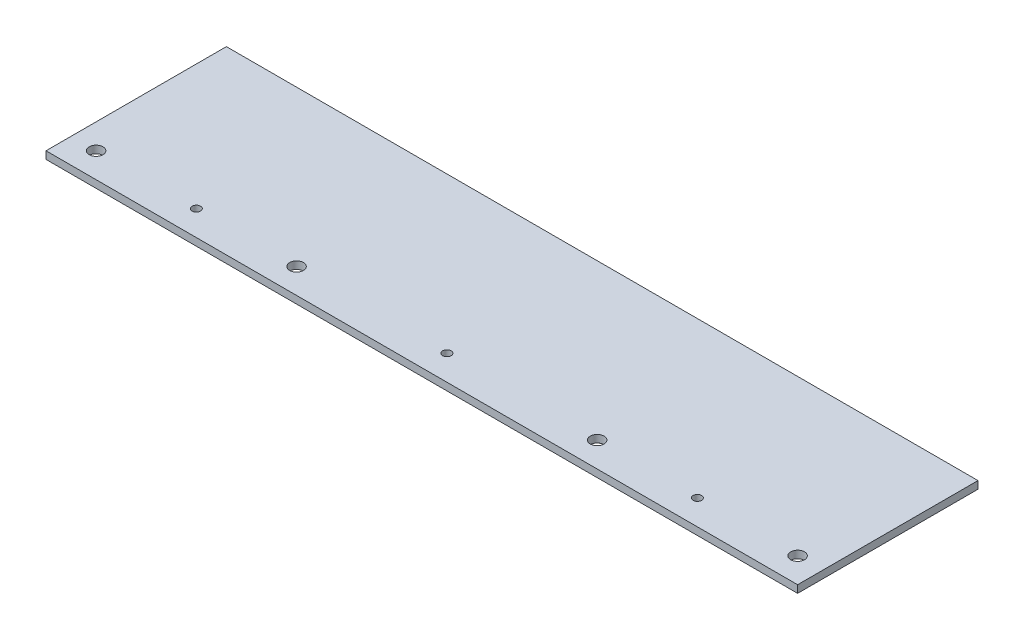
ISO-10303-21;
HEADER;
FILE_DESCRIPTION(('STEP AP214'),'2;1');
FILE_NAME('part.step','',(''),(''),'','','');
FILE_SCHEMA(('AUTOMOTIVE_DESIGN { 1 0 10303 214 1 1 1 1 }'));
ENDSEC;
DATA;
#1=APPLICATION_CONTEXT('core data for automotive mechanical design processes');
#2=APPLICATION_PROTOCOL_DEFINITION('international standard','automotive_design',2000,#1);
#3=PRODUCT_CONTEXT('',#1,'mechanical');
#4=PRODUCT('Part','Part','',(#3));
#5=PRODUCT_RELATED_PRODUCT_CATEGORY('part','',(#4));
#6=PRODUCT_DEFINITION_FORMATION('','',#4);
#7=PRODUCT_DEFINITION_CONTEXT('part definition',#1,'design');
#8=PRODUCT_DEFINITION('design','',#6,#7);
#9=PRODUCT_DEFINITION_SHAPE('','',#8);
#10=(LENGTH_UNIT() NAMED_UNIT(*) SI_UNIT(.MILLI.,.METRE.));
#11=(NAMED_UNIT(*) PLANE_ANGLE_UNIT() SI_UNIT($,.RADIAN.));
#12=(NAMED_UNIT(*) SI_UNIT($,.STERADIAN.) SOLID_ANGLE_UNIT());
#13=UNCERTAINTY_MEASURE_WITH_UNIT(LENGTH_MEASURE(1.E-05),#10,'distance_accuracy_value','');
#14=(GEOMETRIC_REPRESENTATION_CONTEXT(3) GLOBAL_UNCERTAINTY_ASSIGNED_CONTEXT((#13)) GLOBAL_UNIT_ASSIGNED_CONTEXT((#10,
#11,#12)) REPRESENTATION_CONTEXT('',''));
#15=CARTESIAN_POINT('',(0.,0.,0.));
#16=DIRECTION('',(0.,0.,1.));
#17=DIRECTION('',(1.,0.,0.));
#18=AXIS2_PLACEMENT_3D('',#15,#16,#17);
#19=CARTESIAN_POINT('',(0.,3.,0.));
#20=DIRECTION('',(1.,0.,0.));
#21=DIRECTION('',(0.,0.,-1.));
#22=AXIS2_PLACEMENT_3D('',#19,#20,#21);
#23=PLANE('',#22);
#24=DIRECTION('',(0.,0.,1.));
#25=VECTOR('',#24,1.);
#26=CARTESIAN_POINT('',(0.,0.,0.));
#27=LINE('',#26,#25);
#28=CARTESIAN_POINT('',(0.,0.,-72.));
#29=VERTEX_POINT('',#28);
#30=CARTESIAN_POINT('',(0.,0.,0.));
#31=VERTEX_POINT('',#30);
#32=EDGE_CURVE('E105',#29,#31,#27,.T.);
#33=ORIENTED_EDGE('',*,*,#32,.T.);
#34=DIRECTION('',(0.,-1.,0.));
#35=VECTOR('',#34,1.);
#36=CARTESIAN_POINT('',(0.,3.,0.));
#37=LINE('',#36,#35);
#38=CARTESIAN_POINT('',(0.,3.,0.));
#39=VERTEX_POINT('',#38);
#40=EDGE_CURVE('E11',#39,#31,#37,.T.);
#41=ORIENTED_EDGE('',*,*,#40,.F.);
#42=DIRECTION('',(0.,0.,1.));
#43=VECTOR('',#42,1.);
#44=CARTESIAN_POINT('',(0.,3.,0.));
#45=LINE('',#44,#43);
#46=CARTESIAN_POINT('',(0.,3.,-72.));
#47=VERTEX_POINT('',#46);
#48=EDGE_CURVE('E92',#47,#39,#45,.T.);
#49=ORIENTED_EDGE('',*,*,#48,.F.);
#50=DIRECTION('',(0.,-1.,0.));
#51=VECTOR('',#50,1.);
#52=CARTESIAN_POINT('',(0.,3.,-72.));
#53=LINE('',#52,#51);
#54=EDGE_CURVE('E101',#47,#29,#53,.T.);
#55=ORIENTED_EDGE('',*,*,#54,.T.);
#56=EDGE_LOOP('',(#33,#41,#49,#55));
#57=FACE_BOUND('',#56,.T.);
#58=ADVANCED_FACE('F39',(#57),#23,.F.);
#59=CARTESIAN_POINT('',(0.,3.,0.));
#60=DIRECTION('',(0.,0.,-1.));
#61=DIRECTION('',(-1.,0.,0.));
#62=AXIS2_PLACEMENT_3D('',#59,#60,#61);
#63=PLANE('',#62);
#64=DIRECTION('',(1.,0.,0.));
#65=VECTOR('',#64,1.);
#66=CARTESIAN_POINT('',(0.,0.,0.));
#67=LINE('',#66,#65);
#68=CARTESIAN_POINT('',(300.,0.,0.));
#69=VERTEX_POINT('',#68);
#70=EDGE_CURVE('E96',#31,#69,#67,.T.);
#71=ORIENTED_EDGE('',*,*,#70,.T.);
#72=DIRECTION('',(0.,-1.,0.));
#73=VECTOR('',#72,1.);
#74=CARTESIAN_POINT('',(300.,3.,0.));
#75=LINE('',#74,#73);
#76=CARTESIAN_POINT('',(300.,3.,0.));
#77=VERTEX_POINT('',#76);
#78=EDGE_CURVE('E48',#77,#69,#75,.T.);
#79=ORIENTED_EDGE('',*,*,#78,.F.);
#80=DIRECTION('',(1.,0.,0.));
#81=VECTOR('',#80,1.);
#82=CARTESIAN_POINT('',(0.,3.,0.));
#83=LINE('',#82,#81);
#84=EDGE_CURVE('E87',#39,#77,#83,.T.);
#85=ORIENTED_EDGE('',*,*,#84,.F.);
#86=ORIENTED_EDGE('',*,*,#40,.T.);
#87=EDGE_LOOP('',(#71,#79,#85,#86));
#88=FACE_BOUND('',#87,.T.);
#89=ADVANCED_FACE('F95',(#88),#63,.F.);
#90=CARTESIAN_POINT('',(300.,3.,0.));
#91=DIRECTION('',(-1.,0.,0.));
#92=DIRECTION('',(0.,0.,1.));
#93=AXIS2_PLACEMENT_3D('',#90,#91,#92);
#94=PLANE('',#93);
#95=DIRECTION('',(0.,0.,-1.));
#96=VECTOR('',#95,1.);
#97=CARTESIAN_POINT('',(300.,0.,0.));
#98=LINE('',#97,#96);
#99=CARTESIAN_POINT('',(300.,0.,-72.));
#100=VERTEX_POINT('',#99);
#101=EDGE_CURVE('E74',#69,#100,#98,.T.);
#102=ORIENTED_EDGE('',*,*,#101,.T.);
#103=DIRECTION('',(0.,-1.,0.));
#104=VECTOR('',#103,1.);
#105=CARTESIAN_POINT('',(300.,3.,-72.));
#106=LINE('',#105,#104);
#107=CARTESIAN_POINT('',(300.,3.,-72.));
#108=VERTEX_POINT('',#107);
#109=EDGE_CURVE('E97',#108,#100,#106,.T.);
#110=ORIENTED_EDGE('',*,*,#109,.F.);
#111=DIRECTION('',(0.,0.,-1.));
#112=VECTOR('',#111,1.);
#113=CARTESIAN_POINT('',(300.,3.,0.));
#114=LINE('',#113,#112);
#115=EDGE_CURVE('E90',#77,#108,#114,.T.);
#116=ORIENTED_EDGE('',*,*,#115,.F.);
#117=ORIENTED_EDGE('',*,*,#78,.T.);
#118=EDGE_LOOP('',(#102,#110,#116,#117));
#119=FACE_BOUND('',#118,.T.);
#120=ADVANCED_FACE('F99',(#119),#94,.F.);
#121=CARTESIAN_POINT('',(0.,3.,-72.));
#122=DIRECTION('',(0.,0.,1.));
#123=DIRECTION('',(1.,0.,0.));
#124=AXIS2_PLACEMENT_3D('',#121,#122,#123);
#125=PLANE('',#124);
#126=DIRECTION('',(-1.,0.,0.));
#127=VECTOR('',#126,1.);
#128=CARTESIAN_POINT('',(0.,0.,-72.));
#129=LINE('',#128,#127);
#130=EDGE_CURVE('E80',#100,#29,#129,.T.);
#131=ORIENTED_EDGE('',*,*,#130,.T.);
#132=ORIENTED_EDGE('',*,*,#54,.F.);
#133=DIRECTION('',(-1.,0.,0.));
#134=VECTOR('',#133,1.);
#135=CARTESIAN_POINT('',(0.,3.,-72.));
#136=LINE('',#135,#134);
#137=EDGE_CURVE('E57',#108,#47,#136,.T.);
#138=ORIENTED_EDGE('',*,*,#137,.F.);
#139=ORIENTED_EDGE('',*,*,#109,.T.);
#140=EDGE_LOOP('',(#131,#132,#138,#139));
#141=FACE_BOUND('',#140,.T.);
#142=ADVANCED_FACE('F189',(#141),#125,.F.);
#143=CARTESIAN_POINT('',(0.,3.,0.));
#144=DIRECTION('',(0.,-1.,0.));
#145=DIRECTION('',(0.,0.,-1.));
#146=AXIS2_PLACEMENT_3D('',#143,#144,#145);
#147=PLANE('',#146);
#148=CARTESIAN_POINT('',(50.,3.,-10.));
#149=DIRECTION('',(0.,-1.,0.));
#150=DIRECTION('',(0.,0.,-1.));
#151=AXIS2_PLACEMENT_3D('',#148,#149,#150);
#152=CIRCLE('',#151,1.7);
#153=CARTESIAN_POINT('',(50.,3.,-11.7));
#154=VERTEX_POINT('',#153);
#155=EDGE_CURVE('E42',#154,#154,#152,.T.);
#156=ORIENTED_EDGE('',*,*,#155,.T.);
#157=EDGE_LOOP('',(#156));
#158=FACE_BOUND('',#157,.T.);
#159=CARTESIAN_POINT('',(250.,3.,-10.));
#160=DIRECTION('',(0.,-1.,0.));
#161=DIRECTION('',(0.,0.,-1.));
#162=AXIS2_PLACEMENT_3D('',#159,#160,#161);
#163=CIRCLE('',#162,1.70000000000001);
#164=CARTESIAN_POINT('',(250.,3.,-11.7));
#165=VERTEX_POINT('',#164);
#166=EDGE_CURVE('E136',#165,#165,#163,.T.);
#167=ORIENTED_EDGE('',*,*,#166,.T.);
#168=EDGE_LOOP('',(#167));
#169=FACE_BOUND('',#168,.T.);
#170=CARTESIAN_POINT('',(150.,3.,-10.));
#171=DIRECTION('',(0.,-1.,0.));
#172=DIRECTION('',(0.,0.,-1.));
#173=AXIS2_PLACEMENT_3D('',#170,#171,#172);
#174=CIRCLE('',#173,1.70000000000001);
#175=CARTESIAN_POINT('',(150.,3.,-11.7));
#176=VERTEX_POINT('',#175);
#177=EDGE_CURVE('E132',#176,#176,#174,.T.);
#178=ORIENTED_EDGE('',*,*,#177,.T.);
#179=EDGE_LOOP('',(#178));
#180=FACE_BOUND('',#179,.T.);
#181=CARTESIAN_POINT('',(10.,3.,-10.));
#182=DIRECTION('',(0.,-1.,0.));
#183=DIRECTION('',(0.,0.,-1.));
#184=AXIS2_PLACEMENT_3D('',#181,#182,#183);
#185=CIRCLE('',#184,2.75);
#186=CARTESIAN_POINT('',(10.,3.,-12.75));
#187=VERTEX_POINT('',#186);
#188=EDGE_CURVE('E127',#187,#187,#185,.T.);
#189=ORIENTED_EDGE('',*,*,#188,.T.);
#190=EDGE_LOOP('',(#189));
#191=FACE_BOUND('',#190,.T.);
#192=CARTESIAN_POINT('',(90.,3.,-10.));
#193=DIRECTION('',(0.,-1.,0.));
#194=DIRECTION('',(0.,0.,-1.));
#195=AXIS2_PLACEMENT_3D('',#192,#193,#194);
#196=CIRCLE('',#195,2.75);
#197=CARTESIAN_POINT('',(90.,3.,-12.75));
#198=VERTEX_POINT('',#197);
#199=EDGE_CURVE('E122',#198,#198,#196,.T.);
#200=ORIENTED_EDGE('',*,*,#199,.T.);
#201=EDGE_LOOP('',(#200));
#202=FACE_BOUND('',#201,.T.);
#203=CARTESIAN_POINT('',(210.,3.,-10.));
#204=DIRECTION('',(0.,-1.,0.));
#205=DIRECTION('',(0.,0.,-1.));
#206=AXIS2_PLACEMENT_3D('',#203,#204,#205);
#207=CIRCLE('',#206,2.75);
#208=CARTESIAN_POINT('',(210.,3.,-12.75));
#209=VERTEX_POINT('',#208);
#210=EDGE_CURVE('E117',#209,#209,#207,.T.);
#211=ORIENTED_EDGE('',*,*,#210,.T.);
#212=EDGE_LOOP('',(#211));
#213=FACE_BOUND('',#212,.T.);
#214=CARTESIAN_POINT('',(290.,3.,-10.));
#215=DIRECTION('',(0.,-1.,0.));
#216=DIRECTION('',(0.,0.,-1.));
#217=AXIS2_PLACEMENT_3D('',#214,#215,#216);
#218=CIRCLE('',#217,2.74999999999997);
#219=CARTESIAN_POINT('',(290.,3.,-12.75));
#220=VERTEX_POINT('',#219);
#221=EDGE_CURVE('E108',#220,#220,#218,.T.);
#222=ORIENTED_EDGE('',*,*,#221,.T.);
#223=EDGE_LOOP('',(#222));
#224=FACE_BOUND('',#223,.T.);
#225=ORIENTED_EDGE('',*,*,#48,.T.);
#226=ORIENTED_EDGE('',*,*,#84,.T.);
#227=ORIENTED_EDGE('',*,*,#115,.T.);
#228=ORIENTED_EDGE('',*,*,#137,.T.);
#229=EDGE_LOOP('',(#225,#226,#227,#228));
#230=FACE_BOUND('',#229,.T.);
#231=ADVANCED_FACE('F88',(#158,#169,#180,#191,#202,#213,#224,#230),#147,.F.);
#232=CARTESIAN_POINT('',(0.,0.,0.));
#233=DIRECTION('',(0.,-1.,0.));
#234=DIRECTION('',(0.,0.,-1.));
#235=AXIS2_PLACEMENT_3D('',#232,#233,#234);
#236=PLANE('',#235);
#237=CARTESIAN_POINT('',(50.,0.,-10.));
#238=DIRECTION('',(0.,-1.,0.));
#239=DIRECTION('',(0.,0.,-1.));
#240=AXIS2_PLACEMENT_3D('',#237,#238,#239);
#241=CIRCLE('',#240,1.725);
#242=CARTESIAN_POINT('',(50.,0.,-11.725));
#243=VERTEX_POINT('',#242);
#244=EDGE_CURVE('E368',#243,#243,#241,.T.);
#245=ORIENTED_EDGE('',*,*,#244,.F.);
#246=EDGE_LOOP('',(#245));
#247=FACE_BOUND('',#246,.T.);
#248=CARTESIAN_POINT('',(250.,0.,-10.));
#249=DIRECTION('',(0.,-1.,0.));
#250=DIRECTION('',(0.,0.,-1.));
#251=AXIS2_PLACEMENT_3D('',#248,#249,#250);
#252=CIRCLE('',#251,1.725);
#253=CARTESIAN_POINT('',(250.,0.,-11.725));
#254=VERTEX_POINT('',#253);
#255=EDGE_CURVE('E145',#254,#254,#252,.T.);
#256=ORIENTED_EDGE('',*,*,#255,.F.);
#257=EDGE_LOOP('',(#256));
#258=FACE_BOUND('',#257,.T.);
#259=CARTESIAN_POINT('',(150.,0.,-10.));
#260=DIRECTION('',(0.,-1.,0.));
#261=DIRECTION('',(0.,0.,-1.));
#262=AXIS2_PLACEMENT_3D('',#259,#260,#261);
#263=CIRCLE('',#262,1.725);
#264=CARTESIAN_POINT('',(150.,0.,-11.725));
#265=VERTEX_POINT('',#264);
#266=EDGE_CURVE('E138',#265,#265,#263,.T.);
#267=ORIENTED_EDGE('',*,*,#266,.F.);
#268=EDGE_LOOP('',(#267));
#269=FACE_BOUND('',#268,.T.);
#270=CARTESIAN_POINT('',(10.,0.,-10.));
#271=DIRECTION('',(0.,-1.,0.));
#272=DIRECTION('',(0.,0.,-1.));
#273=AXIS2_PLACEMENT_3D('',#270,#271,#272);
#274=CIRCLE('',#273,2.775);
#275=CARTESIAN_POINT('',(10.,0.,-12.775));
#276=VERTEX_POINT('',#275);
#277=EDGE_CURVE('E134',#276,#276,#274,.T.);
#278=ORIENTED_EDGE('',*,*,#277,.F.);
#279=EDGE_LOOP('',(#278));
#280=FACE_BOUND('',#279,.T.);
#281=CARTESIAN_POINT('',(90.,0.,-10.));
#282=DIRECTION('',(0.,-1.,0.));
#283=DIRECTION('',(0.,0.,-1.));
#284=AXIS2_PLACEMENT_3D('',#281,#282,#283);
#285=CIRCLE('',#284,2.775);
#286=CARTESIAN_POINT('',(90.,0.,-12.775));
#287=VERTEX_POINT('',#286);
#288=EDGE_CURVE('E130',#287,#287,#285,.T.);
#289=ORIENTED_EDGE('',*,*,#288,.F.);
#290=EDGE_LOOP('',(#289));
#291=FACE_BOUND('',#290,.T.);
#292=CARTESIAN_POINT('',(210.,0.,-10.));
#293=DIRECTION('',(0.,-1.,0.));
#294=DIRECTION('',(0.,0.,-1.));
#295=AXIS2_PLACEMENT_3D('',#292,#293,#294);
#296=CIRCLE('',#295,2.775);
#297=CARTESIAN_POINT('',(210.,0.,-12.775));
#298=VERTEX_POINT('',#297);
#299=EDGE_CURVE('E125',#298,#298,#296,.T.);
#300=ORIENTED_EDGE('',*,*,#299,.F.);
#301=EDGE_LOOP('',(#300));
#302=FACE_BOUND('',#301,.T.);
#303=CARTESIAN_POINT('',(290.,0.,-10.));
#304=DIRECTION('',(0.,-1.,0.));
#305=DIRECTION('',(0.,0.,-1.));
#306=AXIS2_PLACEMENT_3D('',#303,#304,#305);
#307=CIRCLE('',#306,2.77500000000003);
#308=CARTESIAN_POINT('',(290.,0.,-12.775));
#309=VERTEX_POINT('',#308);
#310=EDGE_CURVE('E120',#309,#309,#307,.T.);
#311=ORIENTED_EDGE('',*,*,#310,.F.);
#312=EDGE_LOOP('',(#311));
#313=FACE_BOUND('',#312,.T.);
#314=ORIENTED_EDGE('',*,*,#32,.F.);
#315=ORIENTED_EDGE('',*,*,#130,.F.);
#316=ORIENTED_EDGE('',*,*,#101,.F.);
#317=ORIENTED_EDGE('',*,*,#70,.F.);
#318=EDGE_LOOP('',(#314,#315,#316,#317));
#319=FACE_BOUND('',#318,.T.);
#320=ADVANCED_FACE('F182',(#247,#258,#269,#280,#291,#302,#313,#319),#236,.T.);
#321=CARTESIAN_POINT('',(290.,0.,-10.));
#322=DIRECTION('',(0.,-1.,0.));
#323=DIRECTION('',(0.,0.,-1.));
#324=AXIS2_PLACEMENT_3D('',#321,#322,#323);
#325=CYLINDRICAL_SURFACE('',#324,2.74999999999997);
#326=CARTESIAN_POINT('',(290.,0.0250000000000025,-10.));
#327=DIRECTION('',(0.,-1.,0.));
#328=DIRECTION('',(0.,0.,-1.));
#329=AXIS2_PLACEMENT_3D('',#326,#327,#328);
#330=CIRCLE('',#329,2.74999999999997);
#331=CARTESIAN_POINT('',(290.,0.0250000000000025,-12.75));
#332=VERTEX_POINT('',#331);
#333=EDGE_CURVE('E116',#332,#332,#330,.T.);
#334=ORIENTED_EDGE('',*,*,#333,.T.);
#335=EDGE_LOOP('',(#334));
#336=FACE_BOUND('',#335,.T.);
#337=ORIENTED_EDGE('',*,*,#221,.F.);
#338=EDGE_LOOP('',(#337));
#339=FACE_BOUND('',#338,.T.);
#340=ADVANCED_FACE('F172',(#336,#339),#325,.F.);
#341=CARTESIAN_POINT('',(290.,0.,-10.));
#342=DIRECTION('',(0.,-1.,0.));
#343=DIRECTION('',(0.,0.,-1.));
#344=AXIS2_PLACEMENT_3D('',#341,#342,#343);
#345=CONICAL_SURFACE('',#344,2.77500000000003,0.785398163398454);
#346=ORIENTED_EDGE('',*,*,#333,.F.);
#347=EDGE_LOOP('',(#346));
#348=FACE_BOUND('',#347,.T.);
#349=ORIENTED_EDGE('',*,*,#310,.T.);
#350=EDGE_LOOP('',(#349));
#351=FACE_BOUND('',#350,.T.);
#352=ADVANCED_FACE('F175',(#348,#351),#345,.F.);
#353=CARTESIAN_POINT('',(210.,0.,-10.));
#354=DIRECTION('',(0.,-1.,0.));
#355=DIRECTION('',(0.,0.,-1.));
#356=AXIS2_PLACEMENT_3D('',#353,#354,#355);
#357=CYLINDRICAL_SURFACE('',#356,2.75);
#358=CARTESIAN_POINT('',(210.,0.0250000000000025,-10.));
#359=DIRECTION('',(0.,-1.,0.));
#360=DIRECTION('',(0.,0.,-1.));
#361=AXIS2_PLACEMENT_3D('',#358,#359,#360);
#362=CIRCLE('',#361,2.75);
#363=CARTESIAN_POINT('',(210.,0.0250000000000025,-12.75));
#364=VERTEX_POINT('',#363);
#365=EDGE_CURVE('E121',#364,#364,#362,.T.);
#366=ORIENTED_EDGE('',*,*,#365,.T.);
#367=EDGE_LOOP('',(#366));
#368=FACE_BOUND('',#367,.T.);
#369=ORIENTED_EDGE('',*,*,#210,.F.);
#370=EDGE_LOOP('',(#369));
#371=FACE_BOUND('',#370,.T.);
#372=ADVANCED_FACE('F178',(#368,#371),#357,.F.);
#373=CARTESIAN_POINT('',(210.,0.,-10.));
#374=DIRECTION('',(0.,-1.,0.));
#375=DIRECTION('',(0.,0.,-1.));
#376=AXIS2_PLACEMENT_3D('',#373,#374,#375);
#377=CONICAL_SURFACE('',#376,2.775,0.785398163397344);
#378=ORIENTED_EDGE('',*,*,#365,.F.);
#379=EDGE_LOOP('',(#378));
#380=FACE_BOUND('',#379,.T.);
#381=ORIENTED_EDGE('',*,*,#299,.T.);
#382=EDGE_LOOP('',(#381));
#383=FACE_BOUND('',#382,.T.);
#384=ADVANCED_FACE('F252',(#380,#383),#377,.F.);
#385=CARTESIAN_POINT('',(90.,0.,-10.));
#386=DIRECTION('',(0.,-1.,0.));
#387=DIRECTION('',(0.,0.,-1.));
#388=AXIS2_PLACEMENT_3D('',#385,#386,#387);
#389=CYLINDRICAL_SURFACE('',#388,2.75);
#390=CARTESIAN_POINT('',(90.,0.0250000000000025,-10.));
#391=DIRECTION('',(0.,-1.,0.));
#392=DIRECTION('',(0.,0.,-1.));
#393=AXIS2_PLACEMENT_3D('',#390,#391,#392);
#394=CIRCLE('',#393,2.75);
#395=CARTESIAN_POINT('',(90.,0.0250000000000025,-12.75));
#396=VERTEX_POINT('',#395);
#397=EDGE_CURVE('E126',#396,#396,#394,.T.);
#398=ORIENTED_EDGE('',*,*,#397,.T.);
#399=EDGE_LOOP('',(#398));
#400=FACE_BOUND('',#399,.T.);
#401=ORIENTED_EDGE('',*,*,#199,.F.);
#402=EDGE_LOOP('',(#401));
#403=FACE_BOUND('',#402,.T.);
#404=ADVANCED_FACE('F262',(#400,#403),#389,.F.);
#405=CARTESIAN_POINT('',(90.,0.,-10.));
#406=DIRECTION('',(0.,-1.,0.));
#407=DIRECTION('',(0.,0.,-1.));
#408=AXIS2_PLACEMENT_3D('',#405,#406,#407);
#409=CONICAL_SURFACE('',#408,2.775,0.785398163397344);
#410=ORIENTED_EDGE('',*,*,#397,.F.);
#411=EDGE_LOOP('',(#410));
#412=FACE_BOUND('',#411,.T.);
#413=ORIENTED_EDGE('',*,*,#288,.T.);
#414=EDGE_LOOP('',(#413));
#415=FACE_BOUND('',#414,.T.);
#416=ADVANCED_FACE('F272',(#412,#415),#409,.F.);
#417=CARTESIAN_POINT('',(10.,0.,-10.));
#418=DIRECTION('',(0.,-1.,0.));
#419=DIRECTION('',(0.,0.,-1.));
#420=AXIS2_PLACEMENT_3D('',#417,#418,#419);
#421=CYLINDRICAL_SURFACE('',#420,2.75);
#422=CARTESIAN_POINT('',(10.,0.0250000000000025,-10.));
#423=DIRECTION('',(0.,-1.,0.));
#424=DIRECTION('',(0.,0.,-1.));
#425=AXIS2_PLACEMENT_3D('',#422,#423,#424);
#426=CIRCLE('',#425,2.75);
#427=CARTESIAN_POINT('',(10.,0.0250000000000025,-12.75));
#428=VERTEX_POINT('',#427);
#429=EDGE_CURVE('E131',#428,#428,#426,.T.);
#430=ORIENTED_EDGE('',*,*,#429,.T.);
#431=EDGE_LOOP('',(#430));
#432=FACE_BOUND('',#431,.T.);
#433=ORIENTED_EDGE('',*,*,#188,.F.);
#434=EDGE_LOOP('',(#433));
#435=FACE_BOUND('',#434,.T.);
#436=ADVANCED_FACE('F282',(#432,#435),#421,.F.);
#437=CARTESIAN_POINT('',(10.,0.,-10.));
#438=DIRECTION('',(0.,-1.,0.));
#439=DIRECTION('',(0.,0.,-1.));
#440=AXIS2_PLACEMENT_3D('',#437,#438,#439);
#441=CONICAL_SURFACE('',#440,2.775,0.785398163397414);
#442=ORIENTED_EDGE('',*,*,#429,.F.);
#443=EDGE_LOOP('',(#442));
#444=FACE_BOUND('',#443,.T.);
#445=ORIENTED_EDGE('',*,*,#277,.T.);
#446=EDGE_LOOP('',(#445));
#447=FACE_BOUND('',#446,.T.);
#448=ADVANCED_FACE('F292',(#444,#447),#441,.F.);
#449=CARTESIAN_POINT('',(150.,0.,-10.));
#450=DIRECTION('',(0.,-1.,0.));
#451=DIRECTION('',(0.,0.,-1.));
#452=AXIS2_PLACEMENT_3D('',#449,#450,#451);
#453=CYLINDRICAL_SURFACE('',#452,1.70000000000001);
#454=CARTESIAN_POINT('',(150.,0.024999999999999,-10.));
#455=DIRECTION('',(0.,-1.,0.));
#456=DIRECTION('',(0.,0.,-1.));
#457=AXIS2_PLACEMENT_3D('',#454,#455,#456);
#458=CIRCLE('',#457,1.70000000000001);
#459=CARTESIAN_POINT('',(150.,0.024999999999999,-11.7));
#460=VERTEX_POINT('',#459);
#461=EDGE_CURVE('E135',#460,#460,#458,.T.);
#462=ORIENTED_EDGE('',*,*,#461,.T.);
#463=EDGE_LOOP('',(#462));
#464=FACE_BOUND('',#463,.T.);
#465=ORIENTED_EDGE('',*,*,#177,.F.);
#466=EDGE_LOOP('',(#465));
#467=FACE_BOUND('',#466,.T.);
#468=ADVANCED_FACE('F301',(#464,#467),#453,.F.);
#469=CARTESIAN_POINT('',(150.,0.,-10.));
#470=DIRECTION('',(0.,-1.,0.));
#471=DIRECTION('',(0.,0.,-1.));
#472=AXIS2_PLACEMENT_3D('',#469,#470,#471);
#473=CONICAL_SURFACE('',#472,1.725,0.785398163397414);
#474=ORIENTED_EDGE('',*,*,#461,.F.);
#475=EDGE_LOOP('',(#474));
#476=FACE_BOUND('',#475,.T.);
#477=ORIENTED_EDGE('',*,*,#266,.T.);
#478=EDGE_LOOP('',(#477));
#479=FACE_BOUND('',#478,.T.);
#480=ADVANCED_FACE('F310',(#476,#479),#473,.F.);
#481=CARTESIAN_POINT('',(250.,0.,-10.));
#482=DIRECTION('',(0.,-1.,0.));
#483=DIRECTION('',(0.,0.,-1.));
#484=AXIS2_PLACEMENT_3D('',#481,#482,#483);
#485=CYLINDRICAL_SURFACE('',#484,1.70000000000001);
#486=CARTESIAN_POINT('',(250.,0.024999999999999,-10.));
#487=DIRECTION('',(0.,-1.,0.));
#488=DIRECTION('',(0.,0.,-1.));
#489=AXIS2_PLACEMENT_3D('',#486,#487,#488);
#490=CIRCLE('',#489,1.70000000000001);
#491=CARTESIAN_POINT('',(250.,0.024999999999999,-11.7));
#492=VERTEX_POINT('',#491);
#493=EDGE_CURVE('E139',#492,#492,#490,.T.);
#494=ORIENTED_EDGE('',*,*,#493,.T.);
#495=EDGE_LOOP('',(#494));
#496=FACE_BOUND('',#495,.T.);
#497=ORIENTED_EDGE('',*,*,#166,.F.);
#498=EDGE_LOOP('',(#497));
#499=FACE_BOUND('',#498,.T.);
#500=ADVANCED_FACE('F320',(#496,#499),#485,.F.);
#501=CARTESIAN_POINT('',(250.,0.,-10.));
#502=DIRECTION('',(0.,-1.,0.));
#503=DIRECTION('',(0.,0.,-1.));
#504=AXIS2_PLACEMENT_3D('',#501,#502,#503);
#505=CONICAL_SURFACE('',#504,1.725,0.785398163397414);
#506=ORIENTED_EDGE('',*,*,#493,.F.);
#507=EDGE_LOOP('',(#506));
#508=FACE_BOUND('',#507,.T.);
#509=ORIENTED_EDGE('',*,*,#255,.T.);
#510=EDGE_LOOP('',(#509));
#511=FACE_BOUND('',#510,.T.);
#512=ADVANCED_FACE('F330',(#508,#511),#505,.F.);
#513=CARTESIAN_POINT('',(50.,0.,-10.));
#514=DIRECTION('',(0.,-1.,0.));
#515=DIRECTION('',(0.,0.,-1.));
#516=AXIS2_PLACEMENT_3D('',#513,#514,#515);
#517=CYLINDRICAL_SURFACE('',#516,1.7);
#518=CARTESIAN_POINT('',(50.,0.024999999999999,-10.));
#519=DIRECTION('',(0.,-1.,0.));
#520=DIRECTION('',(0.,0.,-1.));
#521=AXIS2_PLACEMENT_3D('',#518,#519,#520);
#522=CIRCLE('',#521,1.7);
#523=CARTESIAN_POINT('',(50.,0.024999999999999,-11.7));
#524=VERTEX_POINT('',#523);
#525=EDGE_CURVE('E365',#524,#524,#522,.T.);
#526=ORIENTED_EDGE('',*,*,#525,.T.);
#527=EDGE_LOOP('',(#526));
#528=FACE_BOUND('',#527,.T.);
#529=ORIENTED_EDGE('',*,*,#155,.F.);
#530=EDGE_LOOP('',(#529));
#531=FACE_BOUND('',#530,.T.);
#532=ADVANCED_FACE('F339',(#528,#531),#517,.F.);
#533=CARTESIAN_POINT('',(50.,0.,-10.));
#534=DIRECTION('',(0.,-1.,0.));
#535=DIRECTION('',(0.,0.,-1.));
#536=AXIS2_PLACEMENT_3D('',#533,#534,#535);
#537=CONICAL_SURFACE('',#536,1.725,0.785398163397414);
#538=ORIENTED_EDGE('',*,*,#525,.F.);
#539=EDGE_LOOP('',(#538));
#540=FACE_BOUND('',#539,.T.);
#541=ORIENTED_EDGE('',*,*,#244,.T.);
#542=EDGE_LOOP('',(#541));
#543=FACE_BOUND('',#542,.T.);
#544=ADVANCED_FACE('F349',(#540,#543),#537,.F.);
#545=CLOSED_SHELL('',(#58,#89,#120,#142,#231,#320,#340,#352,#372,#384,#404,#416,#436,#448,#468,
#480,#500,#512,#532,#544));
#546=MANIFOLD_SOLID_BREP('B2',#545);
#547=ADVANCED_BREP_SHAPE_REPRESENTATION('',(#18,#546),#14);
#548=SHAPE_DEFINITION_REPRESENTATION(#9,#547);
ENDSEC;
END-ISO-10303-21;
